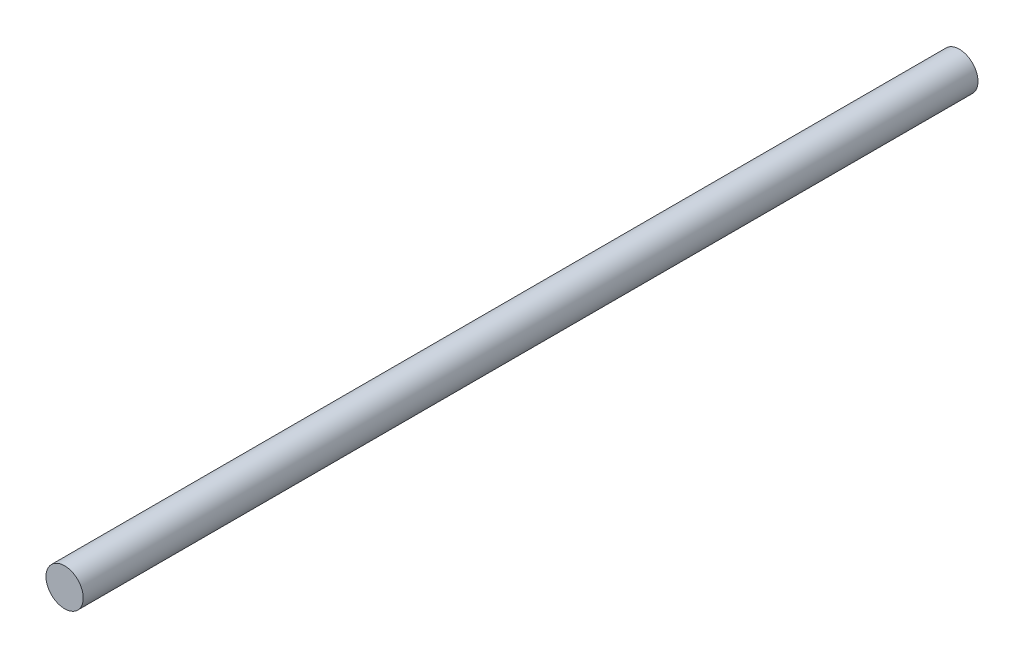
ISO-10303-21;
HEADER;
FILE_DESCRIPTION(('STEP AP214'),'2;1');
FILE_NAME('part.step','',(''),(''),'','','');
FILE_SCHEMA(('AUTOMOTIVE_DESIGN { 1 0 10303 214 1 1 1 1 }'));
ENDSEC;
DATA;
#1=APPLICATION_CONTEXT('core data for automotive mechanical design processes');
#2=APPLICATION_PROTOCOL_DEFINITION('international standard','automotive_design',2000,#1);
#3=PRODUCT_CONTEXT('',#1,'mechanical');
#4=PRODUCT('Part','Part','',(#3));
#5=PRODUCT_RELATED_PRODUCT_CATEGORY('part','',(#4));
#6=PRODUCT_DEFINITION_FORMATION('','',#4);
#7=PRODUCT_DEFINITION_CONTEXT('part definition',#1,'design');
#8=PRODUCT_DEFINITION('design','',#6,#7);
#9=PRODUCT_DEFINITION_SHAPE('','',#8);
#10=(LENGTH_UNIT() NAMED_UNIT(*) SI_UNIT(.MILLI.,.METRE.));
#11=(NAMED_UNIT(*) PLANE_ANGLE_UNIT() SI_UNIT($,.RADIAN.));
#12=(NAMED_UNIT(*) SI_UNIT($,.STERADIAN.) SOLID_ANGLE_UNIT());
#13=UNCERTAINTY_MEASURE_WITH_UNIT(LENGTH_MEASURE(1.E-05),#10,'distance_accuracy_value','');
#14=(GEOMETRIC_REPRESENTATION_CONTEXT(3) GLOBAL_UNCERTAINTY_ASSIGNED_CONTEXT((#13)) GLOBAL_UNIT_ASSIGNED_CONTEXT((#10,
#11,#12)) REPRESENTATION_CONTEXT('',''));
#15=CARTESIAN_POINT('',(0.,0.,0.));
#16=DIRECTION('',(0.,0.,1.));
#17=DIRECTION('',(1.,0.,0.));
#18=AXIS2_PLACEMENT_3D('',#15,#16,#17);
#19=CARTESIAN_POINT('',(0.,0.,120.));
#20=DIRECTION('',(0.,0.,-1.));
#21=DIRECTION('',(-1.,0.,0.));
#22=AXIS2_PLACEMENT_3D('',#19,#20,#21);
#23=CYLINDRICAL_SURFACE('',#22,2.5);
#24=CARTESIAN_POINT('',(0.,0.,120.));
#25=DIRECTION('',(0.,0.,1.));
#26=DIRECTION('',(1.,0.,0.));
#27=AXIS2_PLACEMENT_3D('',#24,#25,#26);
#28=CIRCLE('',#27,2.5);
#29=CARTESIAN_POINT('',(2.5,0.,120.));
#30=VERTEX_POINT('',#29);
#31=EDGE_CURVE('E10',#30,#30,#28,.T.);
#32=ORIENTED_EDGE('',*,*,#31,.F.);
#33=EDGE_LOOP('',(#32));
#34=FACE_BOUND('',#33,.T.);
#35=CARTESIAN_POINT('',(0.,0.,0.));
#36=DIRECTION('',(0.,0.,1.));
#37=DIRECTION('',(1.,0.,0.));
#38=AXIS2_PLACEMENT_3D('',#35,#36,#37);
#39=CIRCLE('',#38,2.5);
#40=CARTESIAN_POINT('',(2.5,0.,0.));
#41=VERTEX_POINT('',#40);
#42=EDGE_CURVE('E33',#41,#41,#39,.T.);
#43=ORIENTED_EDGE('',*,*,#42,.T.);
#44=EDGE_LOOP('',(#43));
#45=FACE_BOUND('',#44,.T.);
#46=ADVANCED_FACE('F30',(#34,#45),#23,.T.);
#47=CARTESIAN_POINT('',(0.,0.,120.));
#48=DIRECTION('',(0.,0.,1.));
#49=DIRECTION('',(1.,0.,0.));
#50=AXIS2_PLACEMENT_3D('',#47,#48,#49);
#51=PLANE('',#50);
#52=ORIENTED_EDGE('',*,*,#31,.T.);
#53=EDGE_LOOP('',(#52));
#54=FACE_BOUND('',#53,.T.);
#55=ADVANCED_FACE('F45',(#54),#51,.T.);
#56=CARTESIAN_POINT('',(0.,0.,0.));
#57=DIRECTION('',(0.,0.,1.));
#58=DIRECTION('',(1.,0.,0.));
#59=AXIS2_PLACEMENT_3D('',#56,#57,#58);
#60=PLANE('',#59);
#61=ORIENTED_EDGE('',*,*,#42,.F.);
#62=EDGE_LOOP('',(#61));
#63=FACE_BOUND('',#62,.T.);
#64=ADVANCED_FACE('F43',(#63),#60,.F.);
#65=CLOSED_SHELL('',(#46,#55,#64));
#66=MANIFOLD_SOLID_BREP('B2',#65);
#67=ADVANCED_BREP_SHAPE_REPRESENTATION('',(#18,#66),#14);
#68=SHAPE_DEFINITION_REPRESENTATION(#9,#67);
ENDSEC;
END-ISO-10303-21;
